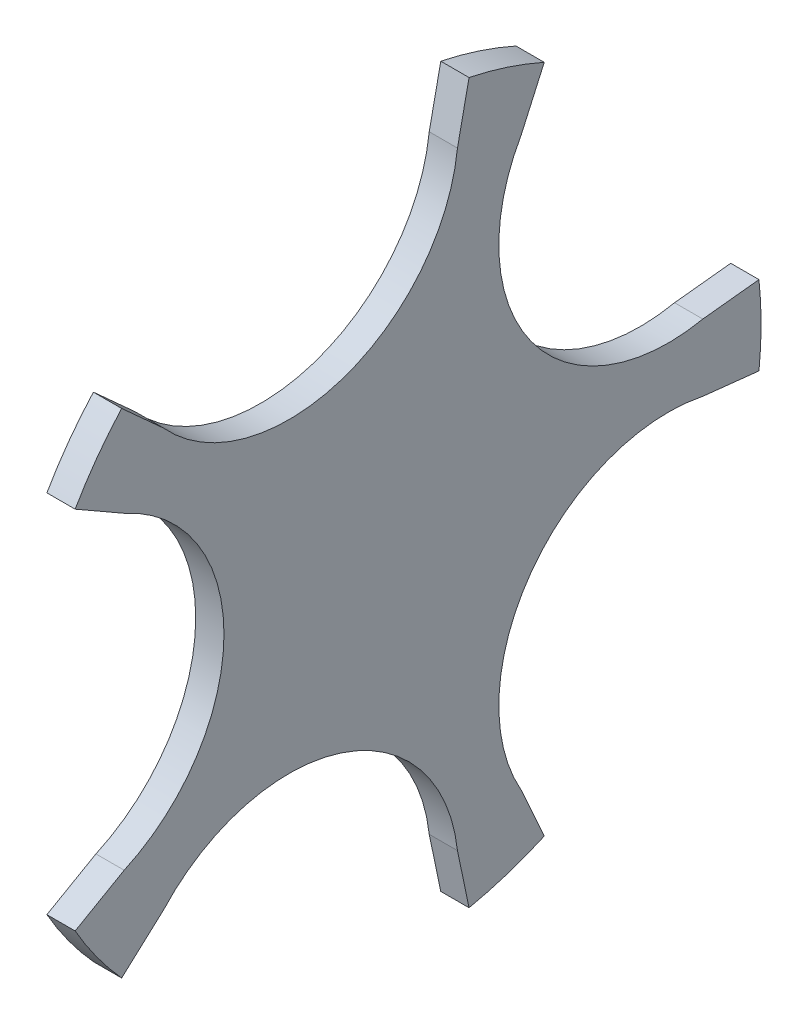
ISO-10303-21;
HEADER;
FILE_DESCRIPTION(('STEP AP214'),'2;1');
FILE_NAME('part.step','',(''),(''),'','','');
FILE_SCHEMA(('AUTOMOTIVE_DESIGN { 1 0 10303 214 1 1 1 1 }'));
ENDSEC;
DATA;
#1=APPLICATION_CONTEXT('core data for automotive mechanical design processes');
#2=APPLICATION_PROTOCOL_DEFINITION('international standard','automotive_design',2000,#1);
#3=PRODUCT_CONTEXT('',#1,'mechanical');
#4=PRODUCT('Part','Part','',(#3));
#5=PRODUCT_RELATED_PRODUCT_CATEGORY('part','',(#4));
#6=PRODUCT_DEFINITION_FORMATION('','',#4);
#7=PRODUCT_DEFINITION_CONTEXT('part definition',#1,'design');
#8=PRODUCT_DEFINITION('design','',#6,#7);
#9=PRODUCT_DEFINITION_SHAPE('','',#8);
#10=(LENGTH_UNIT() NAMED_UNIT(*) SI_UNIT(.MILLI.,.METRE.));
#11=(NAMED_UNIT(*) PLANE_ANGLE_UNIT() SI_UNIT($,.RADIAN.));
#12=(NAMED_UNIT(*) SI_UNIT($,.STERADIAN.) SOLID_ANGLE_UNIT());
#13=UNCERTAINTY_MEASURE_WITH_UNIT(LENGTH_MEASURE(1.E-05),#10,'distance_accuracy_value','');
#14=(GEOMETRIC_REPRESENTATION_CONTEXT(3) GLOBAL_UNCERTAINTY_ASSIGNED_CONTEXT((#13)) GLOBAL_UNIT_ASSIGNED_CONTEXT((#10,
#11,#12)) REPRESENTATION_CONTEXT('',''));
#15=CARTESIAN_POINT('',(0.,0.,0.));
#16=DIRECTION('',(0.,0.,1.));
#17=DIRECTION('',(1.,0.,0.));
#18=AXIS2_PLACEMENT_3D('',#15,#16,#17);
#19=CARTESIAN_POINT('',(5.6538461538462,-2.68838770689506E-12,3.14765574715992E-12));
#20=DIRECTION('',(1.,0.,0.));
#21=DIRECTION('',(0.,0.,-1.));
#22=AXIS2_PLACEMENT_3D('',#19,#20,#21);
#23=CYLINDRICAL_SURFACE('',#22,6.49999999999592);
#24=CARTESIAN_POINT('',(6.1538461538462,-2.68838770689506E-12,3.14765574715992E-12));
#25=DIRECTION('',(1.,0.,0.));
#26=DIRECTION('',(0.,0.,-1.));
#27=AXIS2_PLACEMENT_3D('',#24,#25,#26);
#28=CIRCLE('',#27,6.49999999999592);
#29=CARTESIAN_POINT('',(6.1538461538462,-3.2322010215207,5.6394039185432));
#30=VERTEX_POINT('',#29);
#31=CARTESIAN_POINT('',(6.1538461538462,-4.364586799865,4.8166774924677));
#32=VERTEX_POINT('',#31);
#33=EDGE_CURVE('E206',#30,#32,#28,.T.);
#34=ORIENTED_EDGE('',*,*,#33,.F.);
#35=DIRECTION('',(1.,0.,0.));
#36=VECTOR('',#35,1.);
#37=CARTESIAN_POINT('',(5.6538461538462,-3.2322010215207,5.6394039185432));
#38=LINE('',#37,#36);
#39=CARTESIAN_POINT('',(5.6538461538462,-3.2322010215207,5.6394039185432));
#40=VERTEX_POINT('',#39);
#41=EDGE_CURVE('E11',#40,#30,#38,.T.);
#42=ORIENTED_EDGE('',*,*,#41,.F.);
#43=CARTESIAN_POINT('',(5.6538461538462,-2.68838770689506E-12,3.14765574715992E-12));
#44=DIRECTION('',(1.,0.,0.));
#45=DIRECTION('',(0.,0.,-1.));
#46=AXIS2_PLACEMENT_3D('',#43,#44,#45);
#47=CIRCLE('',#46,6.49999999999592);
#48=CARTESIAN_POINT('',(5.6538461538462,-4.364586799865,4.8166774924677));
#49=VERTEX_POINT('',#48);
#50=EDGE_CURVE('E262',#40,#49,#47,.T.);
#51=ORIENTED_EDGE('',*,*,#50,.T.);
#52=DIRECTION('',(1.,0.,0.));
#53=VECTOR('',#52,1.);
#54=CARTESIAN_POINT('',(5.6538461538462,-4.364586799865,4.8166774924677));
#55=LINE('',#54,#53);
#56=EDGE_CURVE('E40',#49,#32,#55,.T.);
#57=ORIENTED_EDGE('',*,*,#56,.T.);
#58=EDGE_LOOP('',(#34,#42,#51,#57));
#59=FACE_BOUND('',#58,.T.);
#60=ADVANCED_FACE('F37',(#59),#23,.T.);
#61=CARTESIAN_POINT('',(5.6538461538462,-2.7350375460247,4.771974685893));
#62=DIRECTION('',(0.,0.867600602852816,0.497261695618544));
#63=DIRECTION('',(0.,-0.497261695618544,0.867600602852816));
#64=AXIS2_PLACEMENT_3D('',#61,#62,#63);
#65=PLANE('',#64);
#66=DIRECTION('',(0.,-0.497261695618544,0.867600602852816));
#67=VECTOR('',#66,1.);
#68=CARTESIAN_POINT('',(6.1538461538462,-2.7350375460247,4.771974685893));
#69=LINE('',#68,#67);
#70=CARTESIAN_POINT('',(6.1538461538462,-2.7350375460247,4.771974685893));
#71=VERTEX_POINT('',#70);
#72=EDGE_CURVE('E260',#71,#30,#69,.T.);
#73=ORIENTED_EDGE('',*,*,#72,.F.);
#74=DIRECTION('',(1.,0.,0.));
#75=VECTOR('',#74,1.);
#76=CARTESIAN_POINT('',(5.6538461538462,-2.7350375460247,4.771974685893));
#77=LINE('',#76,#75);
#78=CARTESIAN_POINT('',(5.6538461538462,-2.7350375460247,4.771974685893));
#79=VERTEX_POINT('',#78);
#80=EDGE_CURVE('E46',#79,#71,#77,.T.);
#81=ORIENTED_EDGE('',*,*,#80,.F.);
#82=DIRECTION('',(0.,-0.497261695618544,0.867600602852816));
#83=VECTOR('',#82,1.);
#84=CARTESIAN_POINT('',(5.6538461538462,-2.7350375460247,4.771974685893));
#85=LINE('',#84,#83);
#86=EDGE_CURVE('E196',#79,#40,#85,.T.);
#87=ORIENTED_EDGE('',*,*,#86,.T.);
#88=ORIENTED_EDGE('',*,*,#41,.T.);
#89=EDGE_LOOP('',(#73,#81,#87,#88));
#90=FACE_BOUND('',#89,.T.);
#91=ADVANCED_FACE('F298',(#90),#65,.T.);
#92=CARTESIAN_POINT('',(5.6538461538462,0.,6.00601003461137));
#93=DIRECTION('',(1.,0.,0.));
#94=DIRECTION('',(0.,0.,-1.));
#95=AXIS2_PLACEMENT_3D('',#92,#93,#94);
#96=CYLINDRICAL_SURFACE('',#95,3.00054555373706);
#97=CARTESIAN_POINT('',(6.1538461538462,0.,6.00601003461137));
#98=DIRECTION('',(-1.,0.,0.));
#99=DIRECTION('',(0.,0.,1.));
#100=AXIS2_PLACEMENT_3D('',#97,#98,#99);
#101=CIRCLE('',#100,3.00054555373706);
#102=CARTESIAN_POINT('',(6.1538461538462,2.7350375460247,4.771974685893));
#103=VERTEX_POINT('',#102);
#104=EDGE_CURVE('E183',#103,#71,#101,.T.);
#105=ORIENTED_EDGE('',*,*,#104,.F.);
#106=DIRECTION('',(1.,0.,0.));
#107=VECTOR('',#106,1.);
#108=CARTESIAN_POINT('',(5.6538461538462,2.7350375460247,4.771974685893));
#109=LINE('',#108,#107);
#110=CARTESIAN_POINT('',(5.6538461538462,2.7350375460247,4.771974685893));
#111=VERTEX_POINT('',#110);
#112=EDGE_CURVE('E178',#111,#103,#109,.T.);
#113=ORIENTED_EDGE('',*,*,#112,.F.);
#114=CARTESIAN_POINT('',(5.6538461538462,0.,6.00601003461137));
#115=DIRECTION('',(-1.,0.,0.));
#116=DIRECTION('',(0.,0.,1.));
#117=AXIS2_PLACEMENT_3D('',#114,#115,#116);
#118=CIRCLE('',#117,3.00054555373706);
#119=EDGE_CURVE('E181',#111,#79,#118,.T.);
#120=ORIENTED_EDGE('',*,*,#119,.T.);
#121=ORIENTED_EDGE('',*,*,#80,.T.);
#122=EDGE_LOOP('',(#105,#113,#120,#121));
#123=FACE_BOUND('',#122,.T.);
#124=ADVANCED_FACE('F180',(#123),#96,.F.);
#125=CARTESIAN_POINT('',(5.6538461538462,3.2322010215207,5.6394039185432));
#126=DIRECTION('',(0.,-0.867600602852816,0.497261695618544));
#127=DIRECTION('',(0.,-0.497261695618544,-0.867600602852816));
#128=AXIS2_PLACEMENT_3D('',#125,#126,#127);
#129=PLANE('',#128);
#130=DIRECTION('',(0.,-0.497261695618544,-0.867600602852816));
#131=VECTOR('',#130,1.);
#132=CARTESIAN_POINT('',(6.1538461538462,3.2322010215207,5.6394039185432));
#133=LINE('',#132,#131);
#134=CARTESIAN_POINT('',(6.1538461538462,3.2322010215207,5.6394039185432));
#135=VERTEX_POINT('',#134);
#136=EDGE_CURVE('E257',#135,#103,#133,.T.);
#137=ORIENTED_EDGE('',*,*,#136,.F.);
#138=DIRECTION('',(1.,0.,0.));
#139=VECTOR('',#138,1.);
#140=CARTESIAN_POINT('',(5.6538461538462,3.2322010215207,5.6394039185432));
#141=LINE('',#140,#139);
#142=CARTESIAN_POINT('',(5.6538461538462,3.2322010215207,5.6394039185432));
#143=VERTEX_POINT('',#142);
#144=EDGE_CURVE('E188',#143,#135,#141,.T.);
#145=ORIENTED_EDGE('',*,*,#144,.F.);
#146=DIRECTION('',(0.,-0.497261695618544,-0.867600602852816));
#147=VECTOR('',#146,1.);
#148=CARTESIAN_POINT('',(5.6538461538462,3.2322010215207,5.6394039185432));
#149=LINE('',#148,#147);
#150=EDGE_CURVE('E194',#143,#111,#149,.T.);
#151=ORIENTED_EDGE('',*,*,#150,.T.);
#152=ORIENTED_EDGE('',*,*,#112,.T.);
#153=EDGE_LOOP('',(#137,#145,#151,#152));
#154=FACE_BOUND('',#153,.T.);
#155=ADVANCED_FACE('F198',(#154),#129,.T.);
#156=CARTESIAN_POINT('',(5.6538461538462,-2.68838770689506E-12,3.14765574715992E-12));
#157=DIRECTION('',(1.,0.,0.));
#158=DIRECTION('',(0.,0.,-1.));
#159=AXIS2_PLACEMENT_3D('',#156,#157,#158);
#160=CYLINDRICAL_SURFACE('',#159,6.49999999999906);
#161=CARTESIAN_POINT('',(6.1538461538462,-2.68838770689506E-12,3.14765574715992E-12));
#162=DIRECTION('',(1.,0.,0.));
#163=DIRECTION('',(0.,0.,-1.));
#164=AXIS2_PLACEMENT_3D('',#161,#162,#163);
#165=CIRCLE('',#164,6.49999999999906);
#166=CARTESIAN_POINT('',(6.1538461538462,4.36458679986469,4.81667749246735));
#167=VERTEX_POINT('',#166);
#168=EDGE_CURVE('E254',#167,#135,#165,.T.);
#169=ORIENTED_EDGE('',*,*,#168,.F.);
#170=DIRECTION('',(1.,0.,0.));
#171=VECTOR('',#170,1.);
#172=CARTESIAN_POINT('',(5.6538461538462,4.36458679986469,4.81667749246735));
#173=LINE('',#172,#171);
#174=CARTESIAN_POINT('',(5.6538461538462,4.36458679986469,4.81667749246735));
#175=VERTEX_POINT('',#174);
#176=EDGE_CURVE('E266',#175,#167,#173,.T.);
#177=ORIENTED_EDGE('',*,*,#176,.F.);
#178=CARTESIAN_POINT('',(5.6538461538462,-2.68838770689506E-12,3.14765574715992E-12));
#179=DIRECTION('',(1.,0.,0.));
#180=DIRECTION('',(0.,0.,-1.));
#181=AXIS2_PLACEMENT_3D('',#178,#179,#180);
#182=CIRCLE('',#181,6.49999999999906);
#183=EDGE_CURVE('E199',#175,#143,#182,.T.);
#184=ORIENTED_EDGE('',*,*,#183,.T.);
#185=ORIENTED_EDGE('',*,*,#144,.T.);
#186=EDGE_LOOP('',(#169,#177,#184,#185));
#187=FACE_BOUND('',#186,.T.);
#188=ADVANCED_FACE('F311',(#187),#160,.T.);
#189=CARTESIAN_POINT('',(5.6538461538462,3.6932445386389,4.0757965551267));
#190=DIRECTION('',(0.,0.741027306533487,-0.671474892286916));
#191=DIRECTION('',(0.,0.671474892286916,0.741027306533487));
#192=AXIS2_PLACEMENT_3D('',#189,#190,#191);
#193=PLANE('',#192);
#194=DIRECTION('',(0.,0.671474892286916,0.741027306533487));
#195=VECTOR('',#194,1.);
#196=CARTESIAN_POINT('',(6.1538461538462,3.6932445386389,4.0757965551267));
#197=LINE('',#196,#195);
#198=CARTESIAN_POINT('',(6.1538461538462,3.6932445386389,4.0757965551267));
#199=VERTEX_POINT('',#198);
#200=EDGE_CURVE('E251',#199,#167,#197,.T.);
#201=ORIENTED_EDGE('',*,*,#200,.F.);
#202=DIRECTION('',(1.,0.,0.));
#203=VECTOR('',#202,1.);
#204=CARTESIAN_POINT('',(5.6538461538462,3.6932445386389,4.0757965551267));
#205=LINE('',#204,#203);
#206=CARTESIAN_POINT('',(5.6538461538462,3.6932445386389,4.0757965551267));
#207=VERTEX_POINT('',#206);
#208=EDGE_CURVE('E268',#207,#199,#205,.T.);
#209=ORIENTED_EDGE('',*,*,#208,.F.);
#210=DIRECTION('',(0.,0.671474892286916,0.741027306533487));
#211=VECTOR('',#210,1.);
#212=CARTESIAN_POINT('',(5.6538461538462,3.6932445386389,4.0757965551267));
#213=LINE('',#212,#211);
#214=EDGE_CURVE('E201',#207,#175,#213,.T.);
#215=ORIENTED_EDGE('',*,*,#214,.T.);
#216=ORIENTED_EDGE('',*,*,#176,.T.);
#217=EDGE_LOOP('',(#201,#209,#215,#216));
#218=FACE_BOUND('',#217,.T.);
#219=ADVANCED_FACE('F314',(#218),#193,.T.);
#220=CARTESIAN_POINT('',(5.6538461538462,5.71205498035116,1.85595916908136));
#221=DIRECTION('',(1.,0.,0.));
#222=DIRECTION('',(0.,0.,-1.));
#223=AXIS2_PLACEMENT_3D('',#220,#221,#222);
#224=CYLINDRICAL_SURFACE('',#223,3.00054555373703);
#225=CARTESIAN_POINT('',(6.1538461538462,5.71205498035116,1.85595916908136));
#226=DIRECTION('',(-1.,0.,0.));
#227=DIRECTION('',(0.,0.,1.));
#228=AXIS2_PLACEMENT_3D('',#225,#226,#227);
#229=CIRCLE('',#228,3.00054555373703);
#230=CARTESIAN_POINT('',(6.1538461538462,5.3835907025892,-1.1265540057907));
#231=VERTEX_POINT('',#230);
#232=EDGE_CURVE('E248',#231,#199,#229,.T.);
#233=ORIENTED_EDGE('',*,*,#232,.F.);
#234=DIRECTION('',(1.,0.,0.));
#235=VECTOR('',#234,1.);
#236=CARTESIAN_POINT('',(5.6538461538462,5.3835907025892,-1.1265540057907));
#237=LINE('',#236,#235);
#238=CARTESIAN_POINT('',(5.6538461538462,5.3835907025892,-1.1265540057907));
#239=VERTEX_POINT('',#238);
#240=EDGE_CURVE('E270',#239,#231,#237,.T.);
#241=ORIENTED_EDGE('',*,*,#240,.F.);
#242=CARTESIAN_POINT('',(5.6538461538462,5.71205498035116,1.85595916908136));
#243=DIRECTION('',(-1.,0.,0.));
#244=DIRECTION('',(0.,0.,1.));
#245=AXIS2_PLACEMENT_3D('',#242,#243,#244);
#246=CIRCLE('',#245,3.00054555373703);
#247=EDGE_CURVE('E553',#239,#207,#246,.T.);
#248=ORIENTED_EDGE('',*,*,#247,.T.);
#249=ORIENTED_EDGE('',*,*,#208,.T.);
#250=EDGE_LOOP('',(#233,#241,#248,#249));
#251=FACE_BOUND('',#250,.T.);
#252=ADVANCED_FACE('F318',(#251),#224,.F.);
#253=CARTESIAN_POINT('',(5.6538461538462,6.3621968896369,-1.3313341945186));
#254=DIRECTION('',(0.,0.204820645310529,0.978799521482606));
#255=DIRECTION('',(0.,-0.978799521482606,0.204820645310529));
#256=AXIS2_PLACEMENT_3D('',#253,#254,#255);
#257=PLANE('',#256);
#258=DIRECTION('',(0.,-0.978799521482606,0.204820645310529));
#259=VECTOR('',#258,1.);
#260=CARTESIAN_POINT('',(6.1538461538462,6.3621968896369,-1.3313341945186));
#261=LINE('',#260,#259);
#262=CARTESIAN_POINT('',(6.1538461538462,6.3621968896369,-1.3313341945186));
#263=VERTEX_POINT('',#262);
#264=EDGE_CURVE('E245',#263,#231,#261,.T.);
#265=ORIENTED_EDGE('',*,*,#264,.F.);
#266=DIRECTION('',(1.,0.,0.));
#267=VECTOR('',#266,1.);
#268=CARTESIAN_POINT('',(5.6538461538462,6.3621968896369,-1.3313341945186));
#269=LINE('',#268,#267);
#270=CARTESIAN_POINT('',(5.6538461538462,6.3621968896369,-1.3313341945186));
#271=VERTEX_POINT('',#270);
#272=EDGE_CURVE('E272',#271,#263,#269,.T.);
#273=ORIENTED_EDGE('',*,*,#272,.F.);
#274=DIRECTION('',(0.,-0.978799521482606,0.204820645310529));
#275=VECTOR('',#274,1.);
#276=CARTESIAN_POINT('',(5.6538461538462,6.3621968896369,-1.3313341945186));
#277=LINE('',#276,#275);
#278=EDGE_CURVE('E546',#271,#239,#277,.T.);
#279=ORIENTED_EDGE('',*,*,#278,.T.);
#280=ORIENTED_EDGE('',*,*,#240,.T.);
#281=EDGE_LOOP('',(#265,#273,#279,#280));
#282=FACE_BOUND('',#281,.T.);
#283=ADVANCED_FACE('F322',(#282),#257,.T.);
#284=CARTESIAN_POINT('',(5.6538461538462,-2.68838770689506E-12,3.14765574715992E-12));
#285=DIRECTION('',(1.,0.,0.));
#286=DIRECTION('',(0.,0.,-1.));
#287=AXIS2_PLACEMENT_3D('',#284,#285,#286);
#288=CYLINDRICAL_SURFACE('',#287,6.50000000000351);
#289=CARTESIAN_POINT('',(6.1538461538462,-2.68838770689506E-12,3.14765574715992E-12));
#290=DIRECTION('',(1.,0.,0.));
#291=DIRECTION('',(0.,0.,-1.));
#292=AXIS2_PLACEMENT_3D('',#289,#290,#291);
#293=CIRCLE('',#292,6.50000000000351);
#294=CARTESIAN_POINT('',(6.1538461538462,5.92966401068618,-2.6625335153515));
#295=VERTEX_POINT('',#294);
#296=EDGE_CURVE('E242',#295,#263,#293,.T.);
#297=ORIENTED_EDGE('',*,*,#296,.F.);
#298=DIRECTION('',(1.,0.,0.));
#299=VECTOR('',#298,1.);
#300=CARTESIAN_POINT('',(5.6538461538462,5.92966401068618,-2.6625335153515));
#301=LINE('',#300,#299);
#302=CARTESIAN_POINT('',(5.6538461538462,5.92966401068618,-2.6625335153515));
#303=VERTEX_POINT('',#302);
#304=EDGE_CURVE('E274',#303,#295,#301,.T.);
#305=ORIENTED_EDGE('',*,*,#304,.F.);
#306=CARTESIAN_POINT('',(5.6538461538462,-2.68838770689506E-12,3.14765574715992E-12));
#307=DIRECTION('',(1.,0.,0.));
#308=DIRECTION('',(0.,0.,-1.));
#309=AXIS2_PLACEMENT_3D('',#306,#307,#308);
#310=CIRCLE('',#309,6.50000000000351);
#311=EDGE_CURVE('E542',#303,#271,#310,.T.);
#312=ORIENTED_EDGE('',*,*,#311,.T.);
#313=ORIENTED_EDGE('',*,*,#272,.T.);
#314=EDGE_LOOP('',(#297,#305,#312,#313));
#315=FACE_BOUND('',#314,.T.);
#316=ADVANCED_FACE('F326',(#315),#288,.T.);
#317=CARTESIAN_POINT('',(5.6538461538462,5.0175881996684,-2.252993883595));
#318=DIRECTION('',(0.,-0.409620540823316,-0.912256001644064));
#319=DIRECTION('',(0.,0.912256001644064,-0.409620540823316));
#320=AXIS2_PLACEMENT_3D('',#317,#318,#319);
#321=PLANE('',#320);
#322=DIRECTION('',(0.,0.912256001644064,-0.409620540823316));
#323=VECTOR('',#322,1.);
#324=CARTESIAN_POINT('',(6.1538461538462,5.0175881996684,-2.252993883595));
#325=LINE('',#324,#323);
#326=CARTESIAN_POINT('',(6.1538461538462,5.0175881996684,-2.252993883595));
#327=VERTEX_POINT('',#326);
#328=EDGE_CURVE('E239',#327,#295,#325,.T.);
#329=ORIENTED_EDGE('',*,*,#328,.F.);
#330=DIRECTION('',(1.,0.,0.));
#331=VECTOR('',#330,1.);
#332=CARTESIAN_POINT('',(5.6538461538462,5.0175881996684,-2.252993883595));
#333=LINE('',#332,#331);
#334=CARTESIAN_POINT('',(5.6538461538462,5.0175881996684,-2.252993883595));
#335=VERTEX_POINT('',#334);
#336=EDGE_CURVE('E276',#335,#327,#333,.T.);
#337=ORIENTED_EDGE('',*,*,#336,.F.);
#338=DIRECTION('',(0.,0.912256001644064,-0.409620540823316));
#339=VECTOR('',#338,1.);
#340=CARTESIAN_POINT('',(5.6538461538462,5.0175881996684,-2.252993883595));
#341=LINE('',#340,#339);
#342=EDGE_CURVE('E558',#335,#303,#341,.T.);
#343=ORIENTED_EDGE('',*,*,#342,.T.);
#344=ORIENTED_EDGE('',*,*,#304,.T.);
#345=EDGE_LOOP('',(#329,#337,#343,#344));
#346=FACE_BOUND('',#345,.T.);
#347=ADVANCED_FACE('F330',(#346),#321,.T.);
#348=CARTESIAN_POINT('',(5.6538461538462,3.53024412346515,-4.85896418638707));
#349=DIRECTION('',(1.,0.,0.));
#350=DIRECTION('',(0.,0.,-1.));
#351=AXIS2_PLACEMENT_3D('',#348,#349,#350);
#352=CYLINDRICAL_SURFACE('',#351,3.00054555373703);
#353=CARTESIAN_POINT('',(6.1538461538462,3.53024412346515,-4.85896418638707));
#354=DIRECTION('',(-1.,0.,0.));
#355=DIRECTION('',(0.,0.,1.));
#356=AXIS2_PLACEMENT_3D('',#353,#354,#355);
#357=CIRCLE('',#356,3.00054555373703);
#358=CARTESIAN_POINT('',(6.1538461538462,0.59220448969339,-5.468223351634));
#359=VERTEX_POINT('',#358);
#360=EDGE_CURVE('E236',#359,#327,#357,.T.);
#361=ORIENTED_EDGE('',*,*,#360,.F.);
#362=DIRECTION('',(1.,0.,0.));
#363=VECTOR('',#362,1.);
#364=CARTESIAN_POINT('',(5.6538461538462,0.59220448969339,-5.468223351634));
#365=LINE('',#364,#363);
#366=CARTESIAN_POINT('',(5.6538461538462,0.59220448969339,-5.468223351634));
#367=VERTEX_POINT('',#366);
#368=EDGE_CURVE('E278',#367,#359,#365,.T.);
#369=ORIENTED_EDGE('',*,*,#368,.F.);
#370=CARTESIAN_POINT('',(5.6538461538462,3.53024412346515,-4.85896418638707));
#371=DIRECTION('',(-1.,0.,0.));
#372=DIRECTION('',(0.,0.,1.));
#373=AXIS2_PLACEMENT_3D('',#370,#371,#372);
#374=CIRCLE('',#373,3.00054555373703);
#375=EDGE_CURVE('E535',#367,#335,#374,.T.);
#376=ORIENTED_EDGE('',*,*,#375,.T.);
#377=ORIENTED_EDGE('',*,*,#336,.T.);
#378=EDGE_LOOP('',(#361,#369,#376,#377));
#379=FACE_BOUND('',#378,.T.);
#380=ADVANCED_FACE('F334',(#379),#352,.F.);
#381=CARTESIAN_POINT('',(5.6538461538462,0.69985289939375,-6.4622137011407));
#382=DIRECTION('',(0.,0.99418672325241,0.107669676829808));
#383=DIRECTION('',(0.,-0.107669676829808,0.99418672325241));
#384=AXIS2_PLACEMENT_3D('',#381,#382,#383);
#385=PLANE('',#384);
#386=DIRECTION('',(0.,-0.107669676829808,0.994186723252411));
#387=VECTOR('',#386,1.);
#388=CARTESIAN_POINT('',(6.1538461538462,0.69985289939375,-6.4622137011407));
#389=LINE('',#388,#387);
#390=CARTESIAN_POINT('',(6.1538461538462,0.69985289939375,-6.4622137011407));
#391=VERTEX_POINT('',#390);
#392=EDGE_CURVE('E233',#391,#359,#389,.T.);
#393=ORIENTED_EDGE('',*,*,#392,.F.);
#394=DIRECTION('',(1.,0.,0.));
#395=VECTOR('',#394,1.);
#396=CARTESIAN_POINT('',(5.6538461538462,0.69985289939375,-6.4622137011407));
#397=LINE('',#396,#395);
#398=CARTESIAN_POINT('',(5.6538461538462,0.69985289939375,-6.4622137011407));
#399=VERTEX_POINT('',#398);
#400=EDGE_CURVE('E280',#399,#391,#397,.T.);
#401=ORIENTED_EDGE('',*,*,#400,.F.);
#402=DIRECTION('',(0.,-0.107669676829808,0.994186723252411));
#403=VECTOR('',#402,1.);
#404=CARTESIAN_POINT('',(5.6538461538462,0.69985289939375,-6.4622137011407));
#405=LINE('',#404,#403);
#406=EDGE_CURVE('E531',#399,#367,#405,.T.);
#407=ORIENTED_EDGE('',*,*,#406,.T.);
#408=ORIENTED_EDGE('',*,*,#368,.T.);
#409=EDGE_LOOP('',(#393,#401,#407,#408));
#410=FACE_BOUND('',#409,.T.);
#411=ADVANCED_FACE('F338',(#410),#385,.T.);
#412=CARTESIAN_POINT('',(5.6538461538462,-2.68838770689506E-12,3.14765574715992E-12));
#413=DIRECTION('',(1.,0.,0.));
#414=DIRECTION('',(0.,0.,-1.));
#415=AXIS2_PLACEMENT_3D('',#412,#413,#414);
#416=CYLINDRICAL_SURFACE('',#415,6.50000000000316);
#417=CARTESIAN_POINT('',(6.1538461538462,-2.68838770689506E-12,3.14765574715992E-12));
#418=DIRECTION('',(1.,0.,0.));
#419=DIRECTION('',(0.,0.,-1.));
#420=AXIS2_PLACEMENT_3D('',#417,#418,#419);
#421=CIRCLE('',#420,6.50000000000316);
#422=CARTESIAN_POINT('',(6.1538461538462,-0.69985289939378,-6.46221370114099));
#423=VERTEX_POINT('',#422);
#424=EDGE_CURVE('E230',#423,#391,#421,.T.);
#425=ORIENTED_EDGE('',*,*,#424,.F.);
#426=DIRECTION('',(1.,0.,0.));
#427=VECTOR('',#426,1.);
#428=CARTESIAN_POINT('',(5.6538461538462,-0.69985289939378,-6.46221370114099));
#429=LINE('',#428,#427);
#430=CARTESIAN_POINT('',(5.6538461538462,-0.69985289939378,-6.46221370114099));
#431=VERTEX_POINT('',#430);
#432=EDGE_CURVE('E282',#431,#423,#429,.T.);
#433=ORIENTED_EDGE('',*,*,#432,.F.);
#434=CARTESIAN_POINT('',(5.6538461538462,-2.68838770689506E-12,3.14765574715992E-12));
#435=DIRECTION('',(1.,0.,0.));
#436=DIRECTION('',(0.,0.,-1.));
#437=AXIS2_PLACEMENT_3D('',#434,#435,#436);
#438=CIRCLE('',#437,6.50000000000316);
#439=EDGE_CURVE('E562',#431,#399,#438,.T.);
#440=ORIENTED_EDGE('',*,*,#439,.T.);
#441=ORIENTED_EDGE('',*,*,#400,.T.);
#442=EDGE_LOOP('',(#425,#433,#440,#441));
#443=FACE_BOUND('',#442,.T.);
#444=ADVANCED_FACE('F342',(#443),#416,.T.);
#445=CARTESIAN_POINT('',(5.6538461538462,-0.5922044896934,-5.468223351634));
#446=DIRECTION('',(0.,-0.994186723252412,0.107669676829798));
#447=DIRECTION('',(0.,-0.107669676829798,-0.994186723252412));
#448=AXIS2_PLACEMENT_3D('',#445,#446,#447);
#449=PLANE('',#448);
#450=DIRECTION('',(0.,-0.107669676829798,-0.994186723252412));
#451=VECTOR('',#450,1.);
#452=CARTESIAN_POINT('',(6.1538461538462,-0.5922044896934,-5.468223351634));
#453=LINE('',#452,#451);
#454=CARTESIAN_POINT('',(6.1538461538462,-0.5922044896934,-5.468223351634));
#455=VERTEX_POINT('',#454);
#456=EDGE_CURVE('E227',#455,#423,#453,.T.);
#457=ORIENTED_EDGE('',*,*,#456,.F.);
#458=DIRECTION('',(1.,0.,0.));
#459=VECTOR('',#458,1.);
#460=CARTESIAN_POINT('',(5.6538461538462,-0.5922044896934,-5.468223351634));
#461=LINE('',#460,#459);
#462=CARTESIAN_POINT('',(5.6538461538462,-0.5922044896934,-5.468223351634));
#463=VERTEX_POINT('',#462);
#464=EDGE_CURVE('E284',#463,#455,#461,.T.);
#465=ORIENTED_EDGE('',*,*,#464,.F.);
#466=DIRECTION('',(0.,-0.107669676829798,-0.994186723252412));
#467=VECTOR('',#466,1.);
#468=CARTESIAN_POINT('',(5.6538461538462,-0.5922044896934,-5.468223351634));
#469=LINE('',#468,#467);
#470=EDGE_CURVE('E524',#463,#431,#469,.T.);
#471=ORIENTED_EDGE('',*,*,#470,.T.);
#472=ORIENTED_EDGE('',*,*,#432,.T.);
#473=EDGE_LOOP('',(#457,#465,#471,#472));
#474=FACE_BOUND('',#473,.T.);
#475=ADVANCED_FACE('F346',(#474),#449,.T.);
#476=CARTESIAN_POINT('',(5.6538461538462,-3.53024412346515,-4.85896418638706));
#477=DIRECTION('',(1.,0.,0.));
#478=DIRECTION('',(0.,0.,-1.));
#479=AXIS2_PLACEMENT_3D('',#476,#477,#478);
#480=CYLINDRICAL_SURFACE('',#479,3.00054555373703);
#481=CARTESIAN_POINT('',(6.1538461538462,-3.53024412346515,-4.85896418638706));
#482=DIRECTION('',(-1.,0.,0.));
#483=DIRECTION('',(0.,0.,1.));
#484=AXIS2_PLACEMENT_3D('',#481,#482,#483);
#485=CIRCLE('',#484,3.00054555373703);
#486=CARTESIAN_POINT('',(6.1538461538462,-5.0175881996684,-2.252993883595));
#487=VERTEX_POINT('',#486);
#488=EDGE_CURVE('E224',#487,#455,#485,.T.);
#489=ORIENTED_EDGE('',*,*,#488,.F.);
#490=DIRECTION('',(1.,0.,0.));
#491=VECTOR('',#490,1.);
#492=CARTESIAN_POINT('',(5.6538461538462,-5.0175881996684,-2.252993883595));
#493=LINE('',#492,#491);
#494=CARTESIAN_POINT('',(5.6538461538462,-5.0175881996684,-2.252993883595));
#495=VERTEX_POINT('',#494);
#496=EDGE_CURVE('E286',#495,#487,#493,.T.);
#497=ORIENTED_EDGE('',*,*,#496,.F.);
#498=CARTESIAN_POINT('',(5.6538461538462,-3.53024412346515,-4.85896418638706));
#499=DIRECTION('',(-1.,0.,0.));
#500=DIRECTION('',(0.,0.,1.));
#501=AXIS2_PLACEMENT_3D('',#498,#499,#500);
#502=CIRCLE('',#501,3.00054555373703);
#503=EDGE_CURVE('E520',#495,#463,#502,.T.);
#504=ORIENTED_EDGE('',*,*,#503,.T.);
#505=ORIENTED_EDGE('',*,*,#464,.T.);
#506=EDGE_LOOP('',(#489,#497,#504,#505));
#507=FACE_BOUND('',#506,.T.);
#508=ADVANCED_FACE('F350',(#507),#480,.F.);
#509=CARTESIAN_POINT('',(5.6538461538462,-5.9296640106864,-2.6625335153516));
#510=DIRECTION('',(0.,0.409620540823316,-0.912256001644064));
#511=DIRECTION('',(0.,0.912256001644064,0.409620540823316));
#512=AXIS2_PLACEMENT_3D('',#509,#510,#511);
#513=PLANE('',#512);
#514=DIRECTION('',(0.,0.912256001644064,0.409620540823316));
#515=VECTOR('',#514,1.);
#516=CARTESIAN_POINT('',(6.1538461538462,-5.9296640106864,-2.6625335153516));
#517=LINE('',#516,#515);
#518=CARTESIAN_POINT('',(6.1538461538462,-5.9296640106864,-2.6625335153516));
#519=VERTEX_POINT('',#518);
#520=EDGE_CURVE('E221',#519,#487,#517,.T.);
#521=ORIENTED_EDGE('',*,*,#520,.F.);
#522=DIRECTION('',(1.,0.,0.));
#523=VECTOR('',#522,1.);
#524=CARTESIAN_POINT('',(5.6538461538462,-5.9296640106864,-2.6625335153516));
#525=LINE('',#524,#523);
#526=CARTESIAN_POINT('',(5.6538461538462,-5.9296640106864,-2.6625335153516));
#527=VERTEX_POINT('',#526);
#528=EDGE_CURVE('E288',#527,#519,#525,.T.);
#529=ORIENTED_EDGE('',*,*,#528,.F.);
#530=DIRECTION('',(0.,0.912256001644064,0.409620540823316));
#531=VECTOR('',#530,1.);
#532=CARTESIAN_POINT('',(5.6538461538462,-5.9296640106864,-2.6625335153516));
#533=LINE('',#532,#531);
#534=EDGE_CURVE('E566',#527,#495,#533,.T.);
#535=ORIENTED_EDGE('',*,*,#534,.T.);
#536=ORIENTED_EDGE('',*,*,#496,.T.);
#537=EDGE_LOOP('',(#521,#529,#535,#536));
#538=FACE_BOUND('',#537,.T.);
#539=ADVANCED_FACE('F354',(#538),#513,.T.);
#540=CARTESIAN_POINT('',(5.6538461538462,-2.68838770689506E-12,3.14765574715992E-12));
#541=DIRECTION('',(1.,0.,0.));
#542=DIRECTION('',(0.,0.,-1.));
#543=AXIS2_PLACEMENT_3D('',#540,#541,#542);
#544=CYLINDRICAL_SURFACE('',#543,6.49999999999843);
#545=CARTESIAN_POINT('',(6.1538461538462,-2.68838770689506E-12,3.14765574715992E-12));
#546=DIRECTION('',(1.,0.,0.));
#547=DIRECTION('',(0.,0.,-1.));
#548=AXIS2_PLACEMENT_3D('',#545,#546,#547);
#549=CIRCLE('',#548,6.49999999999843);
#550=CARTESIAN_POINT('',(6.1538461538462,-6.36219688963731,-1.33133419451869));
#551=VERTEX_POINT('',#550);
#552=EDGE_CURVE('E218',#551,#519,#549,.T.);
#553=ORIENTED_EDGE('',*,*,#552,.F.);
#554=DIRECTION('',(1.,0.,0.));
#555=VECTOR('',#554,1.);
#556=CARTESIAN_POINT('',(5.6538461538462,-6.36219688963731,-1.33133419451869));
#557=LINE('',#556,#555);
#558=CARTESIAN_POINT('',(5.6538461538462,-6.36219688963731,-1.33133419451869));
#559=VERTEX_POINT('',#558);
#560=EDGE_CURVE('E290',#559,#551,#557,.T.);
#561=ORIENTED_EDGE('',*,*,#560,.F.);
#562=CARTESIAN_POINT('',(5.6538461538462,-2.68838770689506E-12,3.14765574715992E-12));
#563=DIRECTION('',(1.,0.,0.));
#564=DIRECTION('',(0.,0.,-1.));
#565=AXIS2_PLACEMENT_3D('',#562,#563,#564);
#566=CIRCLE('',#565,6.49999999999843);
#567=EDGE_CURVE('E513',#559,#527,#566,.T.);
#568=ORIENTED_EDGE('',*,*,#567,.T.);
#569=ORIENTED_EDGE('',*,*,#528,.T.);
#570=EDGE_LOOP('',(#553,#561,#568,#569));
#571=FACE_BOUND('',#570,.T.);
#572=ADVANCED_FACE('F358',(#571),#544,.T.);
#573=CARTESIAN_POINT('',(5.6538461538462,-5.3835907025892,-1.1265540057907));
#574=DIRECTION('',(0.,-0.204820645310529,0.978799521482606));
#575=DIRECTION('',(0.,-0.978799521482606,-0.204820645310529));
#576=AXIS2_PLACEMENT_3D('',#573,#574,#575);
#577=PLANE('',#576);
#578=DIRECTION('',(0.,-0.978799521482606,-0.204820645310529));
#579=VECTOR('',#578,1.);
#580=CARTESIAN_POINT('',(6.1538461538462,-5.3835907025892,-1.1265540057907));
#581=LINE('',#580,#579);
#582=CARTESIAN_POINT('',(6.1538461538462,-5.3835907025892,-1.1265540057907));
#583=VERTEX_POINT('',#582);
#584=EDGE_CURVE('E215',#583,#551,#581,.T.);
#585=ORIENTED_EDGE('',*,*,#584,.F.);
#586=DIRECTION('',(1.,0.,0.));
#587=VECTOR('',#586,1.);
#588=CARTESIAN_POINT('',(5.6538461538462,-5.3835907025892,-1.1265540057907));
#589=LINE('',#588,#587);
#590=CARTESIAN_POINT('',(5.6538461538462,-5.3835907025892,-1.1265540057907));
#591=VERTEX_POINT('',#590);
#592=EDGE_CURVE('E292',#591,#583,#589,.T.);
#593=ORIENTED_EDGE('',*,*,#592,.F.);
#594=DIRECTION('',(0.,-0.978799521482606,-0.204820645310529));
#595=VECTOR('',#594,1.);
#596=CARTESIAN_POINT('',(5.6538461538462,-5.3835907025892,-1.1265540057907));
#597=LINE('',#596,#595);
#598=EDGE_CURVE('E509',#591,#559,#597,.T.);
#599=ORIENTED_EDGE('',*,*,#598,.T.);
#600=ORIENTED_EDGE('',*,*,#560,.T.);
#601=EDGE_LOOP('',(#585,#593,#599,#600));
#602=FACE_BOUND('',#601,.T.);
#603=ADVANCED_FACE('F362',(#602),#577,.T.);
#604=CARTESIAN_POINT('',(5.6538461538462,-5.71205498035131,1.85595916908141));
#605=DIRECTION('',(1.,0.,0.));
#606=DIRECTION('',(0.,0.,-1.));
#607=AXIS2_PLACEMENT_3D('',#604,#605,#606);
#608=CYLINDRICAL_SURFACE('',#607,3.0005455537371);
#609=CARTESIAN_POINT('',(6.1538461538462,-5.71205498035131,1.85595916908141));
#610=DIRECTION('',(-1.,0.,0.));
#611=DIRECTION('',(0.,0.,1.));
#612=AXIS2_PLACEMENT_3D('',#609,#610,#611);
#613=CIRCLE('',#612,3.0005455537371);
#614=CARTESIAN_POINT('',(6.1538461538462,-3.6932445386389,4.0757965551267));
#615=VERTEX_POINT('',#614);
#616=EDGE_CURVE('E212',#615,#583,#613,.T.);
#617=ORIENTED_EDGE('',*,*,#616,.F.);
#618=DIRECTION('',(1.,0.,0.));
#619=VECTOR('',#618,1.);
#620=CARTESIAN_POINT('',(5.6538461538462,-3.6932445386389,4.0757965551267));
#621=LINE('',#620,#619);
#622=CARTESIAN_POINT('',(5.6538461538462,-3.6932445386389,4.0757965551267));
#623=VERTEX_POINT('',#622);
#624=EDGE_CURVE('E293',#623,#615,#621,.T.);
#625=ORIENTED_EDGE('',*,*,#624,.F.);
#626=CARTESIAN_POINT('',(5.6538461538462,-5.71205498035131,1.85595916908141));
#627=DIRECTION('',(-1.,0.,0.));
#628=DIRECTION('',(0.,0.,1.));
#629=AXIS2_PLACEMENT_3D('',#626,#627,#628);
#630=CIRCLE('',#629,3.0005455537371);
#631=EDGE_CURVE('E570',#623,#591,#630,.T.);
#632=ORIENTED_EDGE('',*,*,#631,.T.);
#633=ORIENTED_EDGE('',*,*,#592,.T.);
#634=EDGE_LOOP('',(#617,#625,#632,#633));
#635=FACE_BOUND('',#634,.T.);
#636=ADVANCED_FACE('F366',(#635),#608,.F.);
#637=CARTESIAN_POINT('',(5.6538461538462,-4.364586799865,4.8166774924677));
#638=DIRECTION('',(0.,-0.741027306533487,-0.671474892286916));
#639=DIRECTION('',(0.,0.671474892286916,-0.741027306533487));
#640=AXIS2_PLACEMENT_3D('',#637,#638,#639);
#641=PLANE('',#640);
#642=DIRECTION('',(0.,0.671474892286916,-0.741027306533487));
#643=VECTOR('',#642,1.);
#644=CARTESIAN_POINT('',(6.1538461538462,-4.364586799865,4.8166774924677));
#645=LINE('',#644,#643);
#646=EDGE_CURVE('E209',#32,#615,#645,.T.);
#647=ORIENTED_EDGE('',*,*,#646,.F.);
#648=ORIENTED_EDGE('',*,*,#56,.F.);
#649=DIRECTION('',(0.,0.671474892286916,-0.741027306533487));
#650=VECTOR('',#649,1.);
#651=CARTESIAN_POINT('',(5.6538461538462,-4.364586799865,4.8166774924677));
#652=LINE('',#651,#650);
#653=EDGE_CURVE('E572',#49,#623,#652,.T.);
#654=ORIENTED_EDGE('',*,*,#653,.T.);
#655=ORIENTED_EDGE('',*,*,#624,.T.);
#656=EDGE_LOOP('',(#647,#648,#654,#655));
#657=FACE_BOUND('',#656,.T.);
#658=ADVANCED_FACE('F295',(#657),#641,.T.);
#659=CARTESIAN_POINT('',(5.6538461538462,-2.68838770689506E-12,3.14765574715992E-12));
#660=DIRECTION('',(1.,0.,0.));
#661=DIRECTION('',(0.,0.,-1.));
#662=AXIS2_PLACEMENT_3D('',#659,#660,#661);
#663=PLANE('',#662);
#664=ORIENTED_EDGE('',*,*,#50,.F.);
#665=ORIENTED_EDGE('',*,*,#86,.F.);
#666=ORIENTED_EDGE('',*,*,#119,.F.);
#667=ORIENTED_EDGE('',*,*,#150,.F.);
#668=ORIENTED_EDGE('',*,*,#183,.F.);
#669=ORIENTED_EDGE('',*,*,#214,.F.);
#670=ORIENTED_EDGE('',*,*,#247,.F.);
#671=ORIENTED_EDGE('',*,*,#278,.F.);
#672=ORIENTED_EDGE('',*,*,#311,.F.);
#673=ORIENTED_EDGE('',*,*,#342,.F.);
#674=ORIENTED_EDGE('',*,*,#375,.F.);
#675=ORIENTED_EDGE('',*,*,#406,.F.);
#676=ORIENTED_EDGE('',*,*,#439,.F.);
#677=ORIENTED_EDGE('',*,*,#470,.F.);
#678=ORIENTED_EDGE('',*,*,#503,.F.);
#679=ORIENTED_EDGE('',*,*,#534,.F.);
#680=ORIENTED_EDGE('',*,*,#567,.F.);
#681=ORIENTED_EDGE('',*,*,#598,.F.);
#682=ORIENTED_EDGE('',*,*,#631,.F.);
#683=ORIENTED_EDGE('',*,*,#653,.F.);
#684=EDGE_LOOP('',(#664,#665,#666,#667,#668,#669,#670,#671,#672,#673,#674,#675,#676,#677,#678,
#679,#680,#681,#682,#683));
#685=FACE_BOUND('',#684,.T.);
#686=ADVANCED_FACE('F192',(#685),#663,.F.);
#687=CARTESIAN_POINT('',(6.1538461538462,-2.68838770689506E-12,3.14765574715992E-12));
#688=DIRECTION('',(1.,0.,0.));
#689=DIRECTION('',(0.,0.,-1.));
#690=AXIS2_PLACEMENT_3D('',#687,#688,#689);
#691=PLANE('',#690);
#692=ORIENTED_EDGE('',*,*,#33,.T.);
#693=ORIENTED_EDGE('',*,*,#646,.T.);
#694=ORIENTED_EDGE('',*,*,#616,.T.);
#695=ORIENTED_EDGE('',*,*,#584,.T.);
#696=ORIENTED_EDGE('',*,*,#552,.T.);
#697=ORIENTED_EDGE('',*,*,#520,.T.);
#698=ORIENTED_EDGE('',*,*,#488,.T.);
#699=ORIENTED_EDGE('',*,*,#456,.T.);
#700=ORIENTED_EDGE('',*,*,#424,.T.);
#701=ORIENTED_EDGE('',*,*,#392,.T.);
#702=ORIENTED_EDGE('',*,*,#360,.T.);
#703=ORIENTED_EDGE('',*,*,#328,.T.);
#704=ORIENTED_EDGE('',*,*,#296,.T.);
#705=ORIENTED_EDGE('',*,*,#264,.T.);
#706=ORIENTED_EDGE('',*,*,#232,.T.);
#707=ORIENTED_EDGE('',*,*,#200,.T.);
#708=ORIENTED_EDGE('',*,*,#168,.T.);
#709=ORIENTED_EDGE('',*,*,#136,.T.);
#710=ORIENTED_EDGE('',*,*,#104,.T.);
#711=ORIENTED_EDGE('',*,*,#72,.T.);
#712=EDGE_LOOP('',(#692,#693,#694,#695,#696,#697,#698,#699,#700,#701,#702,#703,#704,#705,#706,
#707,#708,#709,#710,#711));
#713=FACE_BOUND('',#712,.T.);
#714=ADVANCED_FACE('F297',(#713),#691,.T.);
#715=CLOSED_SHELL('',(#60,#91,#124,#155,#188,#219,#252,#283,#316,#347,#380,#411,#444,#475,#508,
#539,#572,#603,#636,#658,#686,#714));
#716=MANIFOLD_SOLID_BREP('B2',#715);
#717=ADVANCED_BREP_SHAPE_REPRESENTATION('',(#18,#716),#14);
#718=SHAPE_DEFINITION_REPRESENTATION(#9,#717);
ENDSEC;
END-ISO-10303-21;
